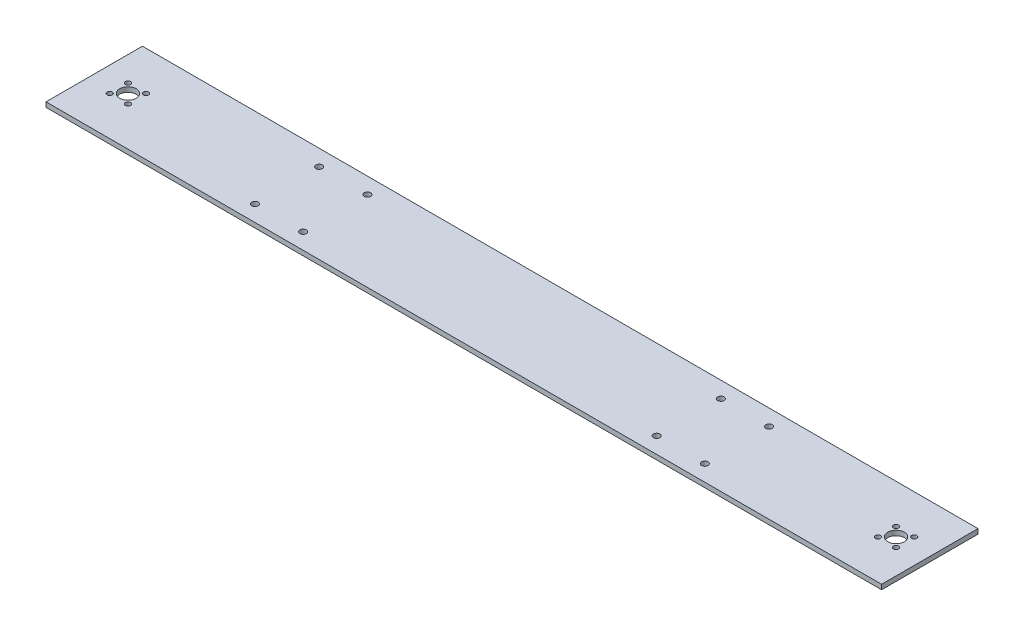
ISO-10303-21;
HEADER;
FILE_DESCRIPTION(('STEP AP214'),'2;1');
FILE_NAME('part.step','',(''),(''),'','','');
FILE_SCHEMA(('AUTOMOTIVE_DESIGN { 1 0 10303 214 1 1 1 1 }'));
ENDSEC;
DATA;
#1=APPLICATION_CONTEXT('core data for automotive mechanical design processes');
#2=APPLICATION_PROTOCOL_DEFINITION('international standard','automotive_design',2000,#1);
#3=PRODUCT_CONTEXT('',#1,'mechanical');
#4=PRODUCT('Part','Part','',(#3));
#5=PRODUCT_RELATED_PRODUCT_CATEGORY('part','',(#4));
#6=PRODUCT_DEFINITION_FORMATION('','',#4);
#7=PRODUCT_DEFINITION_CONTEXT('part definition',#1,'design');
#8=PRODUCT_DEFINITION('design','',#6,#7);
#9=PRODUCT_DEFINITION_SHAPE('','',#8);
#10=(LENGTH_UNIT() NAMED_UNIT(*) SI_UNIT(.MILLI.,.METRE.));
#11=(NAMED_UNIT(*) PLANE_ANGLE_UNIT() SI_UNIT($,.RADIAN.));
#12=(NAMED_UNIT(*) SI_UNIT($,.STERADIAN.) SOLID_ANGLE_UNIT());
#13=UNCERTAINTY_MEASURE_WITH_UNIT(LENGTH_MEASURE(1.E-05),#10,'distance_accuracy_value','');
#14=(GEOMETRIC_REPRESENTATION_CONTEXT(3) GLOBAL_UNCERTAINTY_ASSIGNED_CONTEXT((#13)) GLOBAL_UNIT_ASSIGNED_CONTEXT((#10,
#11,#12)) REPRESENTATION_CONTEXT('',''));
#15=CARTESIAN_POINT('',(0.,0.,0.));
#16=DIRECTION('',(0.,0.,1.));
#17=DIRECTION('',(1.,0.,0.));
#18=AXIS2_PLACEMENT_3D('',#15,#16,#17);
#19=CARTESIAN_POINT('',(0.,3.,0.));
#20=DIRECTION('',(-1.,0.,0.));
#21=DIRECTION('',(0.,0.,1.));
#22=AXIS2_PLACEMENT_3D('',#19,#20,#21);
#23=PLANE('',#22);
#24=DIRECTION('',(0.,0.,-1.));
#25=VECTOR('',#24,1.);
#26=CARTESIAN_POINT('',(0.,0.,0.));
#27=LINE('',#26,#25);
#28=CARTESIAN_POINT('',(0.,0.,0.));
#29=VERTEX_POINT('',#28);
#30=CARTESIAN_POINT('',(0.,0.,-60.));
#31=VERTEX_POINT('',#30);
#32=EDGE_CURVE('E102',#29,#31,#27,.T.);
#33=ORIENTED_EDGE('',*,*,#32,.T.);
#34=DIRECTION('',(0.,-1.,0.));
#35=VECTOR('',#34,1.);
#36=CARTESIAN_POINT('',(0.,3.,-60.));
#37=LINE('',#36,#35);
#38=CARTESIAN_POINT('',(0.,3.,-60.));
#39=VERTEX_POINT('',#38);
#40=EDGE_CURVE('E11',#39,#31,#37,.T.);
#41=ORIENTED_EDGE('',*,*,#40,.F.);
#42=DIRECTION('',(0.,0.,-1.));
#43=VECTOR('',#42,1.);
#44=CARTESIAN_POINT('',(0.,3.,0.));
#45=LINE('',#44,#43);
#46=CARTESIAN_POINT('',(0.,3.,0.));
#47=VERTEX_POINT('',#46);
#48=EDGE_CURVE('E89',#47,#39,#45,.T.);
#49=ORIENTED_EDGE('',*,*,#48,.F.);
#50=DIRECTION('',(0.,-1.,0.));
#51=VECTOR('',#50,1.);
#52=CARTESIAN_POINT('',(0.,3.,0.));
#53=LINE('',#52,#51);
#54=EDGE_CURVE('E98',#47,#29,#53,.T.);
#55=ORIENTED_EDGE('',*,*,#54,.T.);
#56=EDGE_LOOP('',(#33,#41,#49,#55));
#57=FACE_BOUND('',#56,.T.);
#58=ADVANCED_FACE('F36',(#57),#23,.F.);
#59=CARTESIAN_POINT('',(0.,3.,-60.));
#60=DIRECTION('',(0.,0.,1.));
#61=DIRECTION('',(1.,0.,0.));
#62=AXIS2_PLACEMENT_3D('',#59,#60,#61);
#63=PLANE('',#62);
#64=DIRECTION('',(-1.,0.,0.));
#65=VECTOR('',#64,1.);
#66=CARTESIAN_POINT('',(0.,0.,-60.));
#67=LINE('',#66,#65);
#68=CARTESIAN_POINT('',(-520.,0.,-60.));
#69=VERTEX_POINT('',#68);
#70=EDGE_CURVE('E93',#31,#69,#67,.T.);
#71=ORIENTED_EDGE('',*,*,#70,.T.);
#72=DIRECTION('',(0.,-1.,0.));
#73=VECTOR('',#72,1.);
#74=CARTESIAN_POINT('',(-520.,3.,-60.));
#75=LINE('',#74,#73);
#76=CARTESIAN_POINT('',(-520.,3.,-60.));
#77=VERTEX_POINT('',#76);
#78=EDGE_CURVE('E45',#77,#69,#75,.T.);
#79=ORIENTED_EDGE('',*,*,#78,.F.);
#80=DIRECTION('',(-1.,0.,0.));
#81=VECTOR('',#80,1.);
#82=CARTESIAN_POINT('',(0.,3.,-60.));
#83=LINE('',#82,#81);
#84=EDGE_CURVE('E84',#39,#77,#83,.T.);
#85=ORIENTED_EDGE('',*,*,#84,.F.);
#86=ORIENTED_EDGE('',*,*,#40,.T.);
#87=EDGE_LOOP('',(#71,#79,#85,#86));
#88=FACE_BOUND('',#87,.T.);
#89=ADVANCED_FACE('F92',(#88),#63,.F.);
#90=CARTESIAN_POINT('',(-520.,3.,0.));
#91=DIRECTION('',(1.,0.,0.));
#92=DIRECTION('',(0.,0.,-1.));
#93=AXIS2_PLACEMENT_3D('',#90,#91,#92);
#94=PLANE('',#93);
#95=DIRECTION('',(0.,0.,1.));
#96=VECTOR('',#95,1.);
#97=CARTESIAN_POINT('',(-520.,0.,0.));
#98=LINE('',#97,#96);
#99=CARTESIAN_POINT('',(-520.,0.,0.));
#100=VERTEX_POINT('',#99);
#101=EDGE_CURVE('E71',#69,#100,#98,.T.);
#102=ORIENTED_EDGE('',*,*,#101,.T.);
#103=DIRECTION('',(0.,-1.,0.));
#104=VECTOR('',#103,1.);
#105=CARTESIAN_POINT('',(-520.,3.,0.));
#106=LINE('',#105,#104);
#107=CARTESIAN_POINT('',(-520.,3.,0.));
#108=VERTEX_POINT('',#107);
#109=EDGE_CURVE('E94',#108,#100,#106,.T.);
#110=ORIENTED_EDGE('',*,*,#109,.F.);
#111=DIRECTION('',(0.,0.,1.));
#112=VECTOR('',#111,1.);
#113=CARTESIAN_POINT('',(-520.,3.,0.));
#114=LINE('',#113,#112);
#115=EDGE_CURVE('E87',#77,#108,#114,.T.);
#116=ORIENTED_EDGE('',*,*,#115,.F.);
#117=ORIENTED_EDGE('',*,*,#78,.T.);
#118=EDGE_LOOP('',(#102,#110,#116,#117));
#119=FACE_BOUND('',#118,.T.);
#120=ADVANCED_FACE('F96',(#119),#94,.F.);
#121=CARTESIAN_POINT('',(0.,3.,0.));
#122=DIRECTION('',(0.,0.,-1.));
#123=DIRECTION('',(-1.,0.,0.));
#124=AXIS2_PLACEMENT_3D('',#121,#122,#123);
#125=PLANE('',#124);
#126=DIRECTION('',(1.,0.,0.));
#127=VECTOR('',#126,1.);
#128=CARTESIAN_POINT('',(0.,0.,0.));
#129=LINE('',#128,#127);
#130=EDGE_CURVE('E77',#100,#29,#129,.T.);
#131=ORIENTED_EDGE('',*,*,#130,.T.);
#132=ORIENTED_EDGE('',*,*,#54,.F.);
#133=DIRECTION('',(1.,0.,0.));
#134=VECTOR('',#133,1.);
#135=CARTESIAN_POINT('',(0.,3.,0.));
#136=LINE('',#135,#134);
#137=EDGE_CURVE('E54',#108,#47,#136,.T.);
#138=ORIENTED_EDGE('',*,*,#137,.F.);
#139=ORIENTED_EDGE('',*,*,#109,.T.);
#140=EDGE_LOOP('',(#131,#132,#138,#139));
#141=FACE_BOUND('',#140,.T.);
#142=ADVANCED_FACE('F213',(#141),#125,.F.);
#143=CARTESIAN_POINT('',(0.,3.,0.));
#144=DIRECTION('',(0.,1.,0.));
#145=DIRECTION('',(0.,0.,1.));
#146=AXIS2_PLACEMENT_3D('',#143,#144,#145);
#147=PLANE('',#146);
#148=CARTESIAN_POINT('',(-26.6637002039302,3.,-35.6500000000001));
#149=DIRECTION('',(0.,1.,0.));
#150=DIRECTION('',(0.,0.,1.));
#151=AXIS2_PLACEMENT_3D('',#148,#149,#150);
#152=CIRCLE('',#151,1.59999999999999);
#153=CARTESIAN_POINT('',(-26.6637002039302,3.,-34.0500000000001));
#154=VERTEX_POINT('',#153);
#155=EDGE_CURVE('E431',#154,#154,#152,.T.);
#156=ORIENTED_EDGE('',*,*,#155,.F.);
#157=EDGE_LOOP('',(#156));
#158=FACE_BOUND('',#157,.T.);
#159=CARTESIAN_POINT('',(-26.65,3.,-24.3362997960698));
#160=DIRECTION('',(0.,1.,0.));
#161=DIRECTION('',(0.,0.,1.));
#162=AXIS2_PLACEMENT_3D('',#159,#160,#161);
#163=CIRCLE('',#162,1.6);
#164=CARTESIAN_POINT('',(-26.65,3.,-22.7362997960698));
#165=VERTEX_POINT('',#164);
#166=EDGE_CURVE('E432',#165,#165,#163,.T.);
#167=ORIENTED_EDGE('',*,*,#166,.F.);
#168=EDGE_LOOP('',(#167));
#169=FACE_BOUND('',#168,.T.);
#170=CARTESIAN_POINT('',(-15.3362997960697,3.,-24.35));
#171=DIRECTION('',(0.,1.,0.));
#172=DIRECTION('',(0.,0.,1.));
#173=AXIS2_PLACEMENT_3D('',#170,#171,#172);
#174=CIRCLE('',#173,1.6);
#175=CARTESIAN_POINT('',(-15.3362997960697,3.,-22.75));
#176=VERTEX_POINT('',#175);
#177=EDGE_CURVE('E435',#176,#176,#174,.T.);
#178=ORIENTED_EDGE('',*,*,#177,.F.);
#179=EDGE_LOOP('',(#178));
#180=FACE_BOUND('',#179,.T.);
#181=CARTESIAN_POINT('',(-15.35,3.,-35.6637002039303));
#182=DIRECTION('',(0.,1.,0.));
#183=DIRECTION('',(0.,0.,1.));
#184=AXIS2_PLACEMENT_3D('',#181,#182,#183);
#185=CIRCLE('',#184,1.6);
#186=CARTESIAN_POINT('',(-15.35,3.,-34.0637002039303));
#187=VERTEX_POINT('',#186);
#188=EDGE_CURVE('E123',#187,#187,#185,.T.);
#189=ORIENTED_EDGE('',*,*,#188,.F.);
#190=EDGE_LOOP('',(#189));
#191=FACE_BOUND('',#190,.T.);
#192=CARTESIAN_POINT('',(-504.66370020393,3.,-24.35));
#193=DIRECTION('',(0.,1.,0.));
#194=DIRECTION('',(0.,0.,1.));
#195=AXIS2_PLACEMENT_3D('',#192,#193,#194);
#196=CIRCLE('',#195,1.60000000000003);
#197=CARTESIAN_POINT('',(-504.66370020393,3.,-22.75));
#198=VERTEX_POINT('',#197);
#199=EDGE_CURVE('E130',#198,#198,#196,.T.);
#200=ORIENTED_EDGE('',*,*,#199,.F.);
#201=EDGE_LOOP('',(#200));
#202=FACE_BOUND('',#201,.T.);
#203=CARTESIAN_POINT('',(-493.35,3.,-24.3362997960697));
#204=DIRECTION('',(0.,1.,0.));
#205=DIRECTION('',(0.,0.,1.));
#206=AXIS2_PLACEMENT_3D('',#203,#204,#205);
#207=CIRCLE('',#206,1.60000000000002);
#208=CARTESIAN_POINT('',(-493.35,3.,-22.7362997960697));
#209=VERTEX_POINT('',#208);
#210=EDGE_CURVE('E139',#209,#209,#207,.T.);
#211=ORIENTED_EDGE('',*,*,#210,.F.);
#212=EDGE_LOOP('',(#211));
#213=FACE_BOUND('',#212,.T.);
#214=CARTESIAN_POINT('',(-493.33629979607,3.,-35.6500000000001));
#215=DIRECTION('',(0.,1.,0.));
#216=DIRECTION('',(0.,0.,1.));
#217=AXIS2_PLACEMENT_3D('',#214,#215,#216);
#218=CIRCLE('',#217,1.60000000000002);
#219=CARTESIAN_POINT('',(-493.33629979607,3.,-34.0500000000001));
#220=VERTEX_POINT('',#219);
#221=EDGE_CURVE('E443',#220,#220,#218,.T.);
#222=ORIENTED_EDGE('',*,*,#221,.F.);
#223=EDGE_LOOP('',(#222));
#224=FACE_BOUND('',#223,.T.);
#225=CARTESIAN_POINT('',(-504.65,3.,-35.6637002039303));
#226=DIRECTION('',(0.,1.,0.));
#227=DIRECTION('',(0.,0.,1.));
#228=AXIS2_PLACEMENT_3D('',#225,#226,#227);
#229=CIRCLE('',#228,1.60000000000002);
#230=CARTESIAN_POINT('',(-504.65,3.,-34.0637002039303));
#231=VERTEX_POINT('',#230);
#232=EDGE_CURVE('E147',#231,#231,#229,.T.);
#233=ORIENTED_EDGE('',*,*,#232,.F.);
#234=EDGE_LOOP('',(#233));
#235=FACE_BOUND('',#234,.T.);
#236=CARTESIAN_POINT('',(-21.,3.,-30.));
#237=DIRECTION('',(0.,1.,0.));
#238=DIRECTION('',(0.,0.,1.));
#239=AXIS2_PLACEMENT_3D('',#236,#237,#238);
#240=CIRCLE('',#239,5.15);
#241=CARTESIAN_POINT('',(-21.,3.,-24.85));
#242=VERTEX_POINT('',#241);
#243=EDGE_CURVE('E115',#242,#242,#240,.T.);
#244=ORIENTED_EDGE('',*,*,#243,.F.);
#245=EDGE_LOOP('',(#244));
#246=FACE_BOUND('',#245,.T.);
#247=CARTESIAN_POINT('',(-499.,3.,-30.));
#248=DIRECTION('',(0.,1.,0.));
#249=DIRECTION('',(0.,0.,1.));
#250=AXIS2_PLACEMENT_3D('',#247,#248,#249);
#251=CIRCLE('',#250,5.15000000000001);
#252=CARTESIAN_POINT('',(-499.,3.,-24.85));
#253=VERTEX_POINT('',#252);
#254=EDGE_CURVE('E146',#253,#253,#251,.T.);
#255=ORIENTED_EDGE('',*,*,#254,.F.);
#256=EDGE_LOOP('',(#255));
#257=FACE_BOUND('',#256,.T.);
#258=CARTESIAN_POINT('',(-400.,3.,-50.));
#259=DIRECTION('',(0.,1.,0.));
#260=DIRECTION('',(0.,0.,1.));
#261=AXIS2_PLACEMENT_3D('',#258,#259,#260);
#262=CIRCLE('',#261,2.);
#263=CARTESIAN_POINT('',(-400.,3.,-48.));
#264=VERTEX_POINT('',#263);
#265=EDGE_CURVE('E118',#264,#264,#262,.T.);
#266=ORIENTED_EDGE('',*,*,#265,.F.);
#267=EDGE_LOOP('',(#266));
#268=FACE_BOUND('',#267,.T.);
#269=CARTESIAN_POINT('',(-370.,3.,-50.));
#270=DIRECTION('',(0.,1.,0.));
#271=DIRECTION('',(0.,0.,1.));
#272=AXIS2_PLACEMENT_3D('',#269,#270,#271);
#273=CIRCLE('',#272,2.);
#274=CARTESIAN_POINT('',(-370.,3.,-48.));
#275=VERTEX_POINT('',#274);
#276=EDGE_CURVE('E160',#275,#275,#273,.T.);
#277=ORIENTED_EDGE('',*,*,#276,.F.);
#278=EDGE_LOOP('',(#277));
#279=FACE_BOUND('',#278,.T.);
#280=CARTESIAN_POINT('',(-400.,3.,-9.99999999999994));
#281=DIRECTION('',(0.,1.,0.));
#282=DIRECTION('',(0.,0.,1.));
#283=AXIS2_PLACEMENT_3D('',#280,#281,#282);
#284=CIRCLE('',#283,2.);
#285=CARTESIAN_POINT('',(-400.,3.,-7.99999999999994));
#286=VERTEX_POINT('',#285);
#287=EDGE_CURVE('E166',#286,#286,#284,.T.);
#288=ORIENTED_EDGE('',*,*,#287,.F.);
#289=EDGE_LOOP('',(#288));
#290=FACE_BOUND('',#289,.T.);
#291=CARTESIAN_POINT('',(-370.,3.,-9.99999999999994));
#292=DIRECTION('',(0.,1.,0.));
#293=DIRECTION('',(0.,0.,1.));
#294=AXIS2_PLACEMENT_3D('',#291,#292,#293);
#295=CIRCLE('',#294,2.);
#296=CARTESIAN_POINT('',(-370.,3.,-7.99999999999994));
#297=VERTEX_POINT('',#296);
#298=EDGE_CURVE('E172',#297,#297,#295,.T.);
#299=ORIENTED_EDGE('',*,*,#298,.F.);
#300=EDGE_LOOP('',(#299));
#301=FACE_BOUND('',#300,.T.);
#302=CARTESIAN_POINT('',(-150.,3.,-50.));
#303=DIRECTION('',(0.,1.,0.));
#304=DIRECTION('',(0.,0.,1.));
#305=AXIS2_PLACEMENT_3D('',#302,#303,#304);
#306=CIRCLE('',#305,1.99999999999997);
#307=CARTESIAN_POINT('',(-150.,3.,-48.));
#308=VERTEX_POINT('',#307);
#309=EDGE_CURVE('E178',#308,#308,#306,.T.);
#310=ORIENTED_EDGE('',*,*,#309,.F.);
#311=EDGE_LOOP('',(#310));
#312=FACE_BOUND('',#311,.T.);
#313=CARTESIAN_POINT('',(-120.,3.,-50.));
#314=DIRECTION('',(0.,1.,0.));
#315=DIRECTION('',(0.,0.,1.));
#316=AXIS2_PLACEMENT_3D('',#313,#314,#315);
#317=CIRCLE('',#316,1.99999999999999);
#318=CARTESIAN_POINT('',(-120.,3.,-48.));
#319=VERTEX_POINT('',#318);
#320=EDGE_CURVE('E184',#319,#319,#317,.T.);
#321=ORIENTED_EDGE('',*,*,#320,.F.);
#322=EDGE_LOOP('',(#321));
#323=FACE_BOUND('',#322,.T.);
#324=CARTESIAN_POINT('',(-150.,3.,-9.99999999999994));
#325=DIRECTION('',(0.,1.,0.));
#326=DIRECTION('',(0.,0.,1.));
#327=AXIS2_PLACEMENT_3D('',#324,#325,#326);
#328=CIRCLE('',#327,1.99999999999997);
#329=CARTESIAN_POINT('',(-150.,3.,-7.99999999999997));
#330=VERTEX_POINT('',#329);
#331=EDGE_CURVE('E190',#330,#330,#328,.T.);
#332=ORIENTED_EDGE('',*,*,#331,.F.);
#333=EDGE_LOOP('',(#332));
#334=FACE_BOUND('',#333,.T.);
#335=CARTESIAN_POINT('',(-120.,3.,-9.99999999999994));
#336=DIRECTION('',(0.,1.,0.));
#337=DIRECTION('',(0.,0.,1.));
#338=AXIS2_PLACEMENT_3D('',#335,#336,#337);
#339=CIRCLE('',#338,1.99999999999999);
#340=CARTESIAN_POINT('',(-120.,3.,-7.99999999999996));
#341=VERTEX_POINT('',#340);
#342=EDGE_CURVE('E196',#341,#341,#339,.T.);
#343=ORIENTED_EDGE('',*,*,#342,.F.);
#344=EDGE_LOOP('',(#343));
#345=FACE_BOUND('',#344,.T.);
#346=ORIENTED_EDGE('',*,*,#48,.T.);
#347=ORIENTED_EDGE('',*,*,#84,.T.);
#348=ORIENTED_EDGE('',*,*,#115,.T.);
#349=ORIENTED_EDGE('',*,*,#137,.T.);
#350=EDGE_LOOP('',(#346,#347,#348,#349));
#351=FACE_BOUND('',#350,.T.);
#352=ADVANCED_FACE('F85',(#158,#169,#180,#191,#202,#213,#224,#235,#246,#257,#268,#279,#290,#301,
#312,#323,#334,#345,#351),#147,.T.);
#353=CARTESIAN_POINT('',(0.,0.,0.));
#354=DIRECTION('',(0.,1.,0.));
#355=DIRECTION('',(0.,0.,1.));
#356=AXIS2_PLACEMENT_3D('',#353,#354,#355);
#357=PLANE('',#356);
#358=CARTESIAN_POINT('',(-26.6637002039302,0.,-35.6500000000001));
#359=DIRECTION('',(0.,1.,0.));
#360=DIRECTION('',(0.,0.,1.));
#361=AXIS2_PLACEMENT_3D('',#358,#359,#360);
#362=CIRCLE('',#361,1.59999999999999);
#363=CARTESIAN_POINT('',(-26.6637002039302,0.,-34.0500000000001));
#364=VERTEX_POINT('',#363);
#365=EDGE_CURVE('E39',#364,#364,#362,.T.);
#366=ORIENTED_EDGE('',*,*,#365,.T.);
#367=EDGE_LOOP('',(#366));
#368=FACE_BOUND('',#367,.T.);
#369=CARTESIAN_POINT('',(-26.65,0.,-24.3362997960698));
#370=DIRECTION('',(0.,1.,0.));
#371=DIRECTION('',(0.,0.,1.));
#372=AXIS2_PLACEMENT_3D('',#369,#370,#371);
#373=CIRCLE('',#372,1.6);
#374=CARTESIAN_POINT('',(-26.65,0.,-22.7362997960698));
#375=VERTEX_POINT('',#374);
#376=EDGE_CURVE('E125',#375,#375,#373,.T.);
#377=ORIENTED_EDGE('',*,*,#376,.T.);
#378=EDGE_LOOP('',(#377));
#379=FACE_BOUND('',#378,.T.);
#380=CARTESIAN_POINT('',(-15.3362997960697,0.,-24.35));
#381=DIRECTION('',(0.,1.,0.));
#382=DIRECTION('',(0.,0.,1.));
#383=AXIS2_PLACEMENT_3D('',#380,#381,#382);
#384=CIRCLE('',#383,1.6);
#385=CARTESIAN_POINT('',(-15.3362997960697,0.,-22.75));
#386=VERTEX_POINT('',#385);
#387=EDGE_CURVE('E122',#386,#386,#384,.T.);
#388=ORIENTED_EDGE('',*,*,#387,.T.);
#389=EDGE_LOOP('',(#388));
#390=FACE_BOUND('',#389,.T.);
#391=CARTESIAN_POINT('',(-15.35,0.,-35.6637002039303));
#392=DIRECTION('',(0.,1.,0.));
#393=DIRECTION('',(0.,0.,1.));
#394=AXIS2_PLACEMENT_3D('',#391,#392,#393);
#395=CIRCLE('',#394,1.6);
#396=CARTESIAN_POINT('',(-15.35,0.,-34.0637002039303));
#397=VERTEX_POINT('',#396);
#398=EDGE_CURVE('E119',#397,#397,#395,.T.);
#399=ORIENTED_EDGE('',*,*,#398,.T.);
#400=EDGE_LOOP('',(#399));
#401=FACE_BOUND('',#400,.T.);
#402=CARTESIAN_POINT('',(-504.66370020393,0.,-24.35));
#403=DIRECTION('',(0.,1.,0.));
#404=DIRECTION('',(0.,0.,1.));
#405=AXIS2_PLACEMENT_3D('',#402,#403,#404);
#406=CIRCLE('',#405,1.60000000000003);
#407=CARTESIAN_POINT('',(-504.66370020393,0.,-22.75));
#408=VERTEX_POINT('',#407);
#409=EDGE_CURVE('E134',#408,#408,#406,.T.);
#410=ORIENTED_EDGE('',*,*,#409,.T.);
#411=EDGE_LOOP('',(#410));
#412=FACE_BOUND('',#411,.T.);
#413=CARTESIAN_POINT('',(-493.35,0.,-24.3362997960697));
#414=DIRECTION('',(0.,1.,0.));
#415=DIRECTION('',(0.,0.,1.));
#416=AXIS2_PLACEMENT_3D('',#413,#414,#415);
#417=CIRCLE('',#416,1.60000000000002);
#418=CARTESIAN_POINT('',(-493.35,0.,-22.7362997960697));
#419=VERTEX_POINT('',#418);
#420=EDGE_CURVE('E446',#419,#419,#417,.T.);
#421=ORIENTED_EDGE('',*,*,#420,.T.);
#422=EDGE_LOOP('',(#421));
#423=FACE_BOUND('',#422,.T.);
#424=CARTESIAN_POINT('',(-493.33629979607,0.,-35.6500000000001));
#425=DIRECTION('',(0.,1.,0.));
#426=DIRECTION('',(0.,0.,1.));
#427=AXIS2_PLACEMENT_3D('',#424,#425,#426);
#428=CIRCLE('',#427,1.60000000000002);
#429=CARTESIAN_POINT('',(-493.33629979607,0.,-34.0500000000001));
#430=VERTEX_POINT('',#429);
#431=EDGE_CURVE('E150',#430,#430,#428,.T.);
#432=ORIENTED_EDGE('',*,*,#431,.T.);
#433=EDGE_LOOP('',(#432));
#434=FACE_BOUND('',#433,.T.);
#435=CARTESIAN_POINT('',(-504.65,0.,-35.6637002039303));
#436=DIRECTION('',(0.,1.,0.));
#437=DIRECTION('',(0.,0.,1.));
#438=AXIS2_PLACEMENT_3D('',#435,#436,#437);
#439=CIRCLE('',#438,1.60000000000002);
#440=CARTESIAN_POINT('',(-504.65,0.,-34.0637002039303));
#441=VERTEX_POINT('',#440);
#442=EDGE_CURVE('E143',#441,#441,#439,.T.);
#443=ORIENTED_EDGE('',*,*,#442,.T.);
#444=EDGE_LOOP('',(#443));
#445=FACE_BOUND('',#444,.T.);
#446=CARTESIAN_POINT('',(-21.,0.,-30.));
#447=DIRECTION('',(0.,1.,0.));
#448=DIRECTION('',(0.,0.,1.));
#449=AXIS2_PLACEMENT_3D('',#446,#447,#448);
#450=CIRCLE('',#449,5.15);
#451=CARTESIAN_POINT('',(-21.,0.,-24.85));
#452=VERTEX_POINT('',#451);
#453=EDGE_CURVE('E114',#452,#452,#450,.T.);
#454=ORIENTED_EDGE('',*,*,#453,.T.);
#455=EDGE_LOOP('',(#454));
#456=FACE_BOUND('',#455,.T.);
#457=CARTESIAN_POINT('',(-499.,0.,-30.));
#458=DIRECTION('',(0.,1.,0.));
#459=DIRECTION('',(0.,0.,1.));
#460=AXIS2_PLACEMENT_3D('',#457,#458,#459);
#461=CIRCLE('',#460,5.15000000000001);
#462=CARTESIAN_POINT('',(-499.,0.,-24.85));
#463=VERTEX_POINT('',#462);
#464=EDGE_CURVE('E111',#463,#463,#461,.T.);
#465=ORIENTED_EDGE('',*,*,#464,.T.);
#466=EDGE_LOOP('',(#465));
#467=FACE_BOUND('',#466,.T.);
#468=CARTESIAN_POINT('',(-400.,0.,-50.));
#469=DIRECTION('',(0.,1.,0.));
#470=DIRECTION('',(0.,0.,1.));
#471=AXIS2_PLACEMENT_3D('',#468,#469,#470);
#472=CIRCLE('',#471,2.);
#473=CARTESIAN_POINT('',(-400.,0.,-48.));
#474=VERTEX_POINT('',#473);
#475=EDGE_CURVE('E157',#474,#474,#472,.T.);
#476=ORIENTED_EDGE('',*,*,#475,.T.);
#477=EDGE_LOOP('',(#476));
#478=FACE_BOUND('',#477,.T.);
#479=CARTESIAN_POINT('',(-370.,0.,-50.));
#480=DIRECTION('',(0.,1.,0.));
#481=DIRECTION('',(0.,0.,1.));
#482=AXIS2_PLACEMENT_3D('',#479,#480,#481);
#483=CIRCLE('',#482,2.);
#484=CARTESIAN_POINT('',(-370.,0.,-48.));
#485=VERTEX_POINT('',#484);
#486=EDGE_CURVE('E163',#485,#485,#483,.T.);
#487=ORIENTED_EDGE('',*,*,#486,.T.);
#488=EDGE_LOOP('',(#487));
#489=FACE_BOUND('',#488,.T.);
#490=CARTESIAN_POINT('',(-400.,0.,-9.99999999999994));
#491=DIRECTION('',(0.,1.,0.));
#492=DIRECTION('',(0.,0.,1.));
#493=AXIS2_PLACEMENT_3D('',#490,#491,#492);
#494=CIRCLE('',#493,2.);
#495=CARTESIAN_POINT('',(-400.,0.,-7.99999999999994));
#496=VERTEX_POINT('',#495);
#497=EDGE_CURVE('E169',#496,#496,#494,.T.);
#498=ORIENTED_EDGE('',*,*,#497,.T.);
#499=EDGE_LOOP('',(#498));
#500=FACE_BOUND('',#499,.T.);
#501=CARTESIAN_POINT('',(-370.,0.,-9.99999999999994));
#502=DIRECTION('',(0.,1.,0.));
#503=DIRECTION('',(0.,0.,1.));
#504=AXIS2_PLACEMENT_3D('',#501,#502,#503);
#505=CIRCLE('',#504,2.);
#506=CARTESIAN_POINT('',(-370.,0.,-7.99999999999994));
#507=VERTEX_POINT('',#506);
#508=EDGE_CURVE('E175',#507,#507,#505,.T.);
#509=ORIENTED_EDGE('',*,*,#508,.T.);
#510=EDGE_LOOP('',(#509));
#511=FACE_BOUND('',#510,.T.);
#512=CARTESIAN_POINT('',(-150.,0.,-50.));
#513=DIRECTION('',(0.,1.,0.));
#514=DIRECTION('',(0.,0.,1.));
#515=AXIS2_PLACEMENT_3D('',#512,#513,#514);
#516=CIRCLE('',#515,1.99999999999997);
#517=CARTESIAN_POINT('',(-150.,0.,-48.));
#518=VERTEX_POINT('',#517);
#519=EDGE_CURVE('E181',#518,#518,#516,.T.);
#520=ORIENTED_EDGE('',*,*,#519,.T.);
#521=EDGE_LOOP('',(#520));
#522=FACE_BOUND('',#521,.T.);
#523=CARTESIAN_POINT('',(-120.,0.,-50.));
#524=DIRECTION('',(0.,1.,0.));
#525=DIRECTION('',(0.,0.,1.));
#526=AXIS2_PLACEMENT_3D('',#523,#524,#525);
#527=CIRCLE('',#526,1.99999999999999);
#528=CARTESIAN_POINT('',(-120.,0.,-48.));
#529=VERTEX_POINT('',#528);
#530=EDGE_CURVE('E187',#529,#529,#527,.T.);
#531=ORIENTED_EDGE('',*,*,#530,.T.);
#532=EDGE_LOOP('',(#531));
#533=FACE_BOUND('',#532,.T.);
#534=CARTESIAN_POINT('',(-150.,0.,-9.99999999999994));
#535=DIRECTION('',(0.,1.,0.));
#536=DIRECTION('',(0.,0.,1.));
#537=AXIS2_PLACEMENT_3D('',#534,#535,#536);
#538=CIRCLE('',#537,1.99999999999997);
#539=CARTESIAN_POINT('',(-150.,0.,-7.99999999999997));
#540=VERTEX_POINT('',#539);
#541=EDGE_CURVE('E193',#540,#540,#538,.T.);
#542=ORIENTED_EDGE('',*,*,#541,.T.);
#543=EDGE_LOOP('',(#542));
#544=FACE_BOUND('',#543,.T.);
#545=CARTESIAN_POINT('',(-120.,0.,-9.99999999999994));
#546=DIRECTION('',(0.,1.,0.));
#547=DIRECTION('',(0.,0.,1.));
#548=AXIS2_PLACEMENT_3D('',#545,#546,#547);
#549=CIRCLE('',#548,1.99999999999999);
#550=CARTESIAN_POINT('',(-120.,0.,-7.99999999999996));
#551=VERTEX_POINT('',#550);
#552=EDGE_CURVE('E105',#551,#551,#549,.T.);
#553=ORIENTED_EDGE('',*,*,#552,.T.);
#554=EDGE_LOOP('',(#553));
#555=FACE_BOUND('',#554,.T.);
#556=ORIENTED_EDGE('',*,*,#32,.F.);
#557=ORIENTED_EDGE('',*,*,#130,.F.);
#558=ORIENTED_EDGE('',*,*,#101,.F.);
#559=ORIENTED_EDGE('',*,*,#70,.F.);
#560=EDGE_LOOP('',(#556,#557,#558,#559));
#561=FACE_BOUND('',#560,.T.);
#562=ADVANCED_FACE('F202',(#368,#379,#390,#401,#412,#423,#434,#445,#456,#467,#478,#489,#500,
#511,#522,#533,#544,#555,#561),#357,.F.);
#563=CARTESIAN_POINT('',(-120.,3.,-9.99999999999994));
#564=DIRECTION('',(0.,1.,0.));
#565=DIRECTION('',(0.,0.,1.));
#566=AXIS2_PLACEMENT_3D('',#563,#564,#565);
#567=CYLINDRICAL_SURFACE('',#566,1.99999999999999);
#568=ORIENTED_EDGE('',*,*,#552,.F.);
#569=EDGE_LOOP('',(#568));
#570=FACE_BOUND('',#569,.T.);
#571=ORIENTED_EDGE('',*,*,#342,.T.);
#572=EDGE_LOOP('',(#571));
#573=FACE_BOUND('',#572,.T.);
#574=ADVANCED_FACE('F205',(#570,#573),#567,.F.);
#575=CARTESIAN_POINT('',(-150.,3.,-9.99999999999994));
#576=DIRECTION('',(0.,1.,0.));
#577=DIRECTION('',(0.,0.,1.));
#578=AXIS2_PLACEMENT_3D('',#575,#576,#577);
#579=CYLINDRICAL_SURFACE('',#578,1.99999999999997);
#580=ORIENTED_EDGE('',*,*,#541,.F.);
#581=EDGE_LOOP('',(#580));
#582=FACE_BOUND('',#581,.T.);
#583=ORIENTED_EDGE('',*,*,#331,.T.);
#584=EDGE_LOOP('',(#583));
#585=FACE_BOUND('',#584,.T.);
#586=ADVANCED_FACE('F208',(#582,#585),#579,.F.);
#587=CARTESIAN_POINT('',(-120.,3.,-50.));
#588=DIRECTION('',(0.,1.,0.));
#589=DIRECTION('',(0.,0.,1.));
#590=AXIS2_PLACEMENT_3D('',#587,#588,#589);
#591=CYLINDRICAL_SURFACE('',#590,1.99999999999999);
#592=ORIENTED_EDGE('',*,*,#530,.F.);
#593=EDGE_LOOP('',(#592));
#594=FACE_BOUND('',#593,.T.);
#595=ORIENTED_EDGE('',*,*,#320,.T.);
#596=EDGE_LOOP('',(#595));
#597=FACE_BOUND('',#596,.T.);
#598=ADVANCED_FACE('F257',(#594,#597),#591,.F.);
#599=CARTESIAN_POINT('',(-150.,3.,-50.));
#600=DIRECTION('',(0.,1.,0.));
#601=DIRECTION('',(0.,0.,1.));
#602=AXIS2_PLACEMENT_3D('',#599,#600,#601);
#603=CYLINDRICAL_SURFACE('',#602,1.99999999999997);
#604=ORIENTED_EDGE('',*,*,#519,.F.);
#605=EDGE_LOOP('',(#604));
#606=FACE_BOUND('',#605,.T.);
#607=ORIENTED_EDGE('',*,*,#309,.T.);
#608=EDGE_LOOP('',(#607));
#609=FACE_BOUND('',#608,.T.);
#610=ADVANCED_FACE('F267',(#606,#609),#603,.F.);
#611=CARTESIAN_POINT('',(-370.,3.,-9.99999999999994));
#612=DIRECTION('',(0.,1.,0.));
#613=DIRECTION('',(0.,0.,1.));
#614=AXIS2_PLACEMENT_3D('',#611,#612,#613);
#615=CYLINDRICAL_SURFACE('',#614,2.);
#616=ORIENTED_EDGE('',*,*,#508,.F.);
#617=EDGE_LOOP('',(#616));
#618=FACE_BOUND('',#617,.T.);
#619=ORIENTED_EDGE('',*,*,#298,.T.);
#620=EDGE_LOOP('',(#619));
#621=FACE_BOUND('',#620,.T.);
#622=ADVANCED_FACE('F277',(#618,#621),#615,.F.);
#623=CARTESIAN_POINT('',(-400.,3.,-9.99999999999994));
#624=DIRECTION('',(0.,1.,0.));
#625=DIRECTION('',(0.,0.,1.));
#626=AXIS2_PLACEMENT_3D('',#623,#624,#625);
#627=CYLINDRICAL_SURFACE('',#626,2.);
#628=ORIENTED_EDGE('',*,*,#497,.F.);
#629=EDGE_LOOP('',(#628));
#630=FACE_BOUND('',#629,.T.);
#631=ORIENTED_EDGE('',*,*,#287,.T.);
#632=EDGE_LOOP('',(#631));
#633=FACE_BOUND('',#632,.T.);
#634=ADVANCED_FACE('F287',(#630,#633),#627,.F.);
#635=CARTESIAN_POINT('',(-370.,3.,-50.));
#636=DIRECTION('',(0.,1.,0.));
#637=DIRECTION('',(0.,0.,1.));
#638=AXIS2_PLACEMENT_3D('',#635,#636,#637);
#639=CYLINDRICAL_SURFACE('',#638,2.);
#640=ORIENTED_EDGE('',*,*,#486,.F.);
#641=EDGE_LOOP('',(#640));
#642=FACE_BOUND('',#641,.T.);
#643=ORIENTED_EDGE('',*,*,#276,.T.);
#644=EDGE_LOOP('',(#643));
#645=FACE_BOUND('',#644,.T.);
#646=ADVANCED_FACE('F297',(#642,#645),#639,.F.);
#647=CARTESIAN_POINT('',(-400.,3.,-50.));
#648=DIRECTION('',(0.,1.,0.));
#649=DIRECTION('',(0.,0.,1.));
#650=AXIS2_PLACEMENT_3D('',#647,#648,#649);
#651=CYLINDRICAL_SURFACE('',#650,2.);
#652=ORIENTED_EDGE('',*,*,#475,.F.);
#653=EDGE_LOOP('',(#652));
#654=FACE_BOUND('',#653,.T.);
#655=ORIENTED_EDGE('',*,*,#265,.T.);
#656=EDGE_LOOP('',(#655));
#657=FACE_BOUND('',#656,.T.);
#658=ADVANCED_FACE('F307',(#654,#657),#651,.F.);
#659=CARTESIAN_POINT('',(-499.,-7.,-30.));
#660=DIRECTION('',(0.,1.,0.));
#661=DIRECTION('',(0.,0.,1.));
#662=AXIS2_PLACEMENT_3D('',#659,#660,#661);
#663=CYLINDRICAL_SURFACE('',#662,5.15000000000001);
#664=ORIENTED_EDGE('',*,*,#254,.T.);
#665=EDGE_LOOP('',(#664));
#666=FACE_BOUND('',#665,.T.);
#667=ORIENTED_EDGE('',*,*,#464,.F.);
#668=EDGE_LOOP('',(#667));
#669=FACE_BOUND('',#668,.T.);
#670=ADVANCED_FACE('F317',(#666,#669),#663,.F.);
#671=CARTESIAN_POINT('',(-21.,-7.,-30.));
#672=DIRECTION('',(0.,1.,0.));
#673=DIRECTION('',(0.,0.,1.));
#674=AXIS2_PLACEMENT_3D('',#671,#672,#673);
#675=CYLINDRICAL_SURFACE('',#674,5.15);
#676=ORIENTED_EDGE('',*,*,#243,.T.);
#677=EDGE_LOOP('',(#676));
#678=FACE_BOUND('',#677,.T.);
#679=ORIENTED_EDGE('',*,*,#453,.F.);
#680=EDGE_LOOP('',(#679));
#681=FACE_BOUND('',#680,.T.);
#682=ADVANCED_FACE('F327',(#678,#681),#675,.F.);
#683=CARTESIAN_POINT('',(-504.65,0.,-35.6637002039303));
#684=DIRECTION('',(0.,1.,0.));
#685=DIRECTION('',(0.,0.,1.));
#686=AXIS2_PLACEMENT_3D('',#683,#684,#685);
#687=CYLINDRICAL_SURFACE('',#686,1.60000000000002);
#688=ORIENTED_EDGE('',*,*,#442,.F.);
#689=EDGE_LOOP('',(#688));
#690=FACE_BOUND('',#689,.T.);
#691=ORIENTED_EDGE('',*,*,#232,.T.);
#692=EDGE_LOOP('',(#691));
#693=FACE_BOUND('',#692,.T.);
#694=ADVANCED_FACE('F337',(#690,#693),#687,.F.);
#695=CARTESIAN_POINT('',(-493.33629979607,0.,-35.6500000000001));
#696=DIRECTION('',(0.,1.,0.));
#697=DIRECTION('',(0.,0.,1.));
#698=AXIS2_PLACEMENT_3D('',#695,#696,#697);
#699=CYLINDRICAL_SURFACE('',#698,1.60000000000002);
#700=ORIENTED_EDGE('',*,*,#431,.F.);
#701=EDGE_LOOP('',(#700));
#702=FACE_BOUND('',#701,.T.);
#703=ORIENTED_EDGE('',*,*,#221,.T.);
#704=EDGE_LOOP('',(#703));
#705=FACE_BOUND('',#704,.T.);
#706=ADVANCED_FACE('F347',(#702,#705),#699,.F.);
#707=CARTESIAN_POINT('',(-493.35,0.,-24.3362997960697));
#708=DIRECTION('',(0.,1.,0.));
#709=DIRECTION('',(0.,0.,1.));
#710=AXIS2_PLACEMENT_3D('',#707,#708,#709);
#711=CYLINDRICAL_SURFACE('',#710,1.60000000000002);
#712=ORIENTED_EDGE('',*,*,#420,.F.);
#713=EDGE_LOOP('',(#712));
#714=FACE_BOUND('',#713,.T.);
#715=ORIENTED_EDGE('',*,*,#210,.T.);
#716=EDGE_LOOP('',(#715));
#717=FACE_BOUND('',#716,.T.);
#718=ADVANCED_FACE('F357',(#714,#717),#711,.F.);
#719=CARTESIAN_POINT('',(-504.66370020393,0.,-24.35));
#720=DIRECTION('',(0.,1.,0.));
#721=DIRECTION('',(0.,0.,1.));
#722=AXIS2_PLACEMENT_3D('',#719,#720,#721);
#723=CYLINDRICAL_SURFACE('',#722,1.60000000000003);
#724=ORIENTED_EDGE('',*,*,#409,.F.);
#725=EDGE_LOOP('',(#724));
#726=FACE_BOUND('',#725,.T.);
#727=ORIENTED_EDGE('',*,*,#199,.T.);
#728=EDGE_LOOP('',(#727));
#729=FACE_BOUND('',#728,.T.);
#730=ADVANCED_FACE('F367',(#726,#729),#723,.F.);
#731=CARTESIAN_POINT('',(-15.35,-7.,-35.6637002039303));
#732=DIRECTION('',(0.,1.,0.));
#733=DIRECTION('',(0.,0.,1.));
#734=AXIS2_PLACEMENT_3D('',#731,#732,#733);
#735=CYLINDRICAL_SURFACE('',#734,1.6);
#736=ORIENTED_EDGE('',*,*,#188,.T.);
#737=EDGE_LOOP('',(#736));
#738=FACE_BOUND('',#737,.T.);
#739=ORIENTED_EDGE('',*,*,#398,.F.);
#740=EDGE_LOOP('',(#739));
#741=FACE_BOUND('',#740,.T.);
#742=ADVANCED_FACE('F376',(#738,#741),#735,.F.);
#743=CARTESIAN_POINT('',(-15.3362997960697,-7.,-24.35));
#744=DIRECTION('',(0.,1.,0.));
#745=DIRECTION('',(0.,0.,1.));
#746=AXIS2_PLACEMENT_3D('',#743,#744,#745);
#747=CYLINDRICAL_SURFACE('',#746,1.6);
#748=ORIENTED_EDGE('',*,*,#177,.T.);
#749=EDGE_LOOP('',(#748));
#750=FACE_BOUND('',#749,.T.);
#751=ORIENTED_EDGE('',*,*,#387,.F.);
#752=EDGE_LOOP('',(#751));
#753=FACE_BOUND('',#752,.T.);
#754=ADVANCED_FACE('F395',(#750,#753),#747,.F.);
#755=CARTESIAN_POINT('',(-26.65,-7.,-24.3362997960698));
#756=DIRECTION('',(0.,1.,0.));
#757=DIRECTION('',(0.,0.,1.));
#758=AXIS2_PLACEMENT_3D('',#755,#756,#757);
#759=CYLINDRICAL_SURFACE('',#758,1.6);
#760=ORIENTED_EDGE('',*,*,#166,.T.);
#761=EDGE_LOOP('',(#760));
#762=FACE_BOUND('',#761,.T.);
#763=ORIENTED_EDGE('',*,*,#376,.F.);
#764=EDGE_LOOP('',(#763));
#765=FACE_BOUND('',#764,.T.);
#766=ADVANCED_FACE('F405',(#762,#765),#759,.F.);
#767=CARTESIAN_POINT('',(-26.6637002039302,-7.,-35.6500000000001));
#768=DIRECTION('',(0.,1.,0.));
#769=DIRECTION('',(0.,0.,1.));
#770=AXIS2_PLACEMENT_3D('',#767,#768,#769);
#771=CYLINDRICAL_SURFACE('',#770,1.59999999999999);
#772=ORIENTED_EDGE('',*,*,#155,.T.);
#773=EDGE_LOOP('',(#772));
#774=FACE_BOUND('',#773,.T.);
#775=ORIENTED_EDGE('',*,*,#365,.F.);
#776=EDGE_LOOP('',(#775));
#777=FACE_BOUND('',#776,.T.);
#778=ADVANCED_FACE('F415',(#774,#777),#771,.F.);
#779=CLOSED_SHELL('',(#58,#89,#120,#142,#352,#562,#574,#586,#598,#610,#622,#634,#646,#658,#670,
#682,#694,#706,#718,#730,#742,#754,#766,#778));
#780=MANIFOLD_SOLID_BREP('B2',#779);
#781=ADVANCED_BREP_SHAPE_REPRESENTATION('',(#18,#780),#14);
#782=SHAPE_DEFINITION_REPRESENTATION(#9,#781);
ENDSEC;
END-ISO-10303-21;
